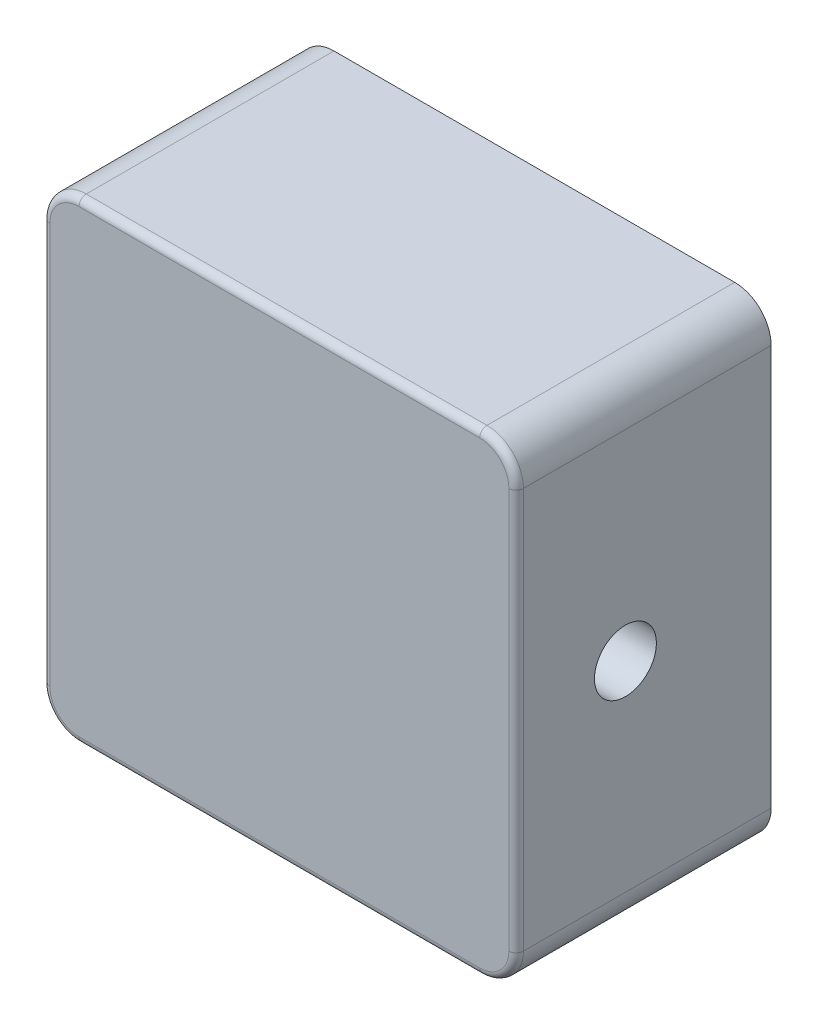
ISO-10303-21;
HEADER;
FILE_DESCRIPTION(('STEP AP214'),'2;1');
FILE_NAME('part.step','',(''),(''),'','','');
FILE_SCHEMA(('AUTOMOTIVE_DESIGN { 1 0 10303 214 1 1 1 1 }'));
ENDSEC;
DATA;
#1=APPLICATION_CONTEXT('core data for automotive mechanical design processes');
#2=APPLICATION_PROTOCOL_DEFINITION('international standard','automotive_design',2000,#1);
#3=PRODUCT_CONTEXT('',#1,'mechanical');
#4=PRODUCT('Part','Part','',(#3));
#5=PRODUCT_RELATED_PRODUCT_CATEGORY('part','',(#4));
#6=PRODUCT_DEFINITION_FORMATION('','',#4);
#7=PRODUCT_DEFINITION_CONTEXT('part definition',#1,'design');
#8=PRODUCT_DEFINITION('design','',#6,#7);
#9=PRODUCT_DEFINITION_SHAPE('','',#8);
#10=(LENGTH_UNIT() NAMED_UNIT(*) SI_UNIT(.MILLI.,.METRE.));
#11=(NAMED_UNIT(*) PLANE_ANGLE_UNIT() SI_UNIT($,.RADIAN.));
#12=(NAMED_UNIT(*) SI_UNIT($,.STERADIAN.) SOLID_ANGLE_UNIT());
#13=UNCERTAINTY_MEASURE_WITH_UNIT(LENGTH_MEASURE(1.E-05),#10,'distance_accuracy_value','');
#14=(GEOMETRIC_REPRESENTATION_CONTEXT(3) GLOBAL_UNCERTAINTY_ASSIGNED_CONTEXT((#13)) GLOBAL_UNIT_ASSIGNED_CONTEXT((#10,
#11,#12)) REPRESENTATION_CONTEXT('',''));
#15=CARTESIAN_POINT('',(0.,0.,0.));
#16=DIRECTION('',(0.,0.,1.));
#17=DIRECTION('',(1.,0.,0.));
#18=AXIS2_PLACEMENT_3D('',#15,#16,#17);
#19=CARTESIAN_POINT('',(0.,0.,177.8));
#20=DIRECTION('',(0.,0.,-1.));
#21=DIRECTION('',(-1.,0.,0.));
#22=AXIS2_PLACEMENT_3D('',#19,#20,#21);
#23=PLANE('',#22);
#24=CARTESIAN_POINT('',(139.7,139.7,177.8));
#25=DIRECTION('',(0.,0.,-1.));
#26=DIRECTION('',(-1.,0.,0.));
#27=AXIS2_PLACEMENT_3D('',#24,#25,#26);
#28=CIRCLE('',#27,20.32);
#29=CARTESIAN_POINT('',(139.7,160.02,177.8));
#30=VERTEX_POINT('',#29);
#31=CARTESIAN_POINT('',(160.02,139.7,177.8));
#32=VERTEX_POINT('',#31);
#33=EDGE_CURVE('E298',#30,#32,#28,.T.);
#34=ORIENTED_EDGE('',*,*,#33,.F.);
#35=DIRECTION('',(-1.,0.,0.));
#36=VECTOR('',#35,1.);
#37=CARTESIAN_POINT('',(0.,160.02,177.8));
#38=LINE('',#37,#36);
#39=CARTESIAN_POINT('',(-139.7,160.02,177.8));
#40=VERTEX_POINT('',#39);
#41=EDGE_CURVE('E312',#30,#40,#38,.T.);
#42=ORIENTED_EDGE('',*,*,#41,.T.);
#43=CARTESIAN_POINT('',(-139.7,139.7,177.8));
#44=DIRECTION('',(0.,0.,-1.));
#45=DIRECTION('',(-1.,0.,0.));
#46=AXIS2_PLACEMENT_3D('',#43,#44,#45);
#47=CIRCLE('',#46,20.32);
#48=CARTESIAN_POINT('',(-160.02,139.7,177.8));
#49=VERTEX_POINT('',#48);
#50=EDGE_CURVE('E339',#49,#40,#47,.T.);
#51=ORIENTED_EDGE('',*,*,#50,.F.);
#52=DIRECTION('',(0.,-1.,0.));
#53=VECTOR('',#52,1.);
#54=CARTESIAN_POINT('',(-160.02,0.,177.8));
#55=LINE('',#54,#53);
#56=CARTESIAN_POINT('',(-160.02,-139.7,177.8));
#57=VERTEX_POINT('',#56);
#58=EDGE_CURVE('E316',#49,#57,#55,.T.);
#59=ORIENTED_EDGE('',*,*,#58,.T.);
#60=CARTESIAN_POINT('',(-139.7,-139.7,177.8));
#61=DIRECTION('',(0.,0.,-1.));
#62=DIRECTION('',(-1.,0.,0.));
#63=AXIS2_PLACEMENT_3D('',#60,#61,#62);
#64=CIRCLE('',#63,20.32);
#65=CARTESIAN_POINT('',(-139.7,-160.02,177.8));
#66=VERTEX_POINT('',#65);
#67=EDGE_CURVE('E307',#66,#57,#64,.T.);
#68=ORIENTED_EDGE('',*,*,#67,.F.);
#69=DIRECTION('',(1.,0.,0.));
#70=VECTOR('',#69,1.);
#71=CARTESIAN_POINT('',(0.,-160.02,177.8));
#72=LINE('',#71,#70);
#73=CARTESIAN_POINT('',(139.7,-160.02,177.8));
#74=VERTEX_POINT('',#73);
#75=EDGE_CURVE('E305',#66,#74,#72,.T.);
#76=ORIENTED_EDGE('',*,*,#75,.T.);
#77=CARTESIAN_POINT('',(139.7,-139.7,177.8));
#78=DIRECTION('',(0.,0.,-1.));
#79=DIRECTION('',(-1.,0.,0.));
#80=AXIS2_PLACEMENT_3D('',#77,#78,#79);
#81=CIRCLE('',#80,20.32);
#82=CARTESIAN_POINT('',(160.02,-139.7,177.8));
#83=VERTEX_POINT('',#82);
#84=EDGE_CURVE('E291',#83,#74,#81,.T.);
#85=ORIENTED_EDGE('',*,*,#84,.F.);
#86=DIRECTION('',(0.,1.,0.));
#87=VECTOR('',#86,1.);
#88=CARTESIAN_POINT('',(160.02,0.,177.8));
#89=LINE('',#88,#87);
#90=EDGE_CURVE('E302',#83,#32,#89,.T.);
#91=ORIENTED_EDGE('',*,*,#90,.T.);
#92=EDGE_LOOP('',(#34,#42,#51,#59,#68,#76,#85,#91));
#93=FACE_BOUND('',#92,.T.);
#94=ADVANCED_FACE('F41',(#93),#23,.F.);
#95=CARTESIAN_POINT('',(165.1,-165.1,177.8));
#96=DIRECTION('',(-1.,0.,0.));
#97=DIRECTION('',(0.,0.,1.));
#98=AXIS2_PLACEMENT_3D('',#95,#96,#97);
#99=PLANE('',#98);
#100=CARTESIAN_POINT('',(165.1,0.,101.6));
#101=DIRECTION('',(-1.,0.,0.));
#102=DIRECTION('',(0.,0.,1.));
#103=AXIS2_PLACEMENT_3D('',#100,#101,#102);
#104=CIRCLE('',#103,21.59);
#105=CARTESIAN_POINT('',(165.1,0.,123.19));
#106=VERTEX_POINT('',#105);
#107=EDGE_CURVE('E171',#106,#106,#104,.T.);
#108=ORIENTED_EDGE('',*,*,#107,.T.);
#109=EDGE_LOOP('',(#108));
#110=FACE_BOUND('',#109,.T.);
#111=DIRECTION('',(0.,1.,0.));
#112=VECTOR('',#111,1.);
#113=CARTESIAN_POINT('',(165.1,-165.1,172.72));
#114=LINE('',#113,#112);
#115=CARTESIAN_POINT('',(165.1,139.7,172.72));
#116=VERTEX_POINT('',#115);
#117=CARTESIAN_POINT('',(165.1,-139.7,172.72));
#118=VERTEX_POINT('',#117);
#119=EDGE_CURVE('E308',#116,#118,#114,.F.);
#120=ORIENTED_EDGE('',*,*,#119,.T.);
#121=DIRECTION('',(0.,0.,-1.));
#122=VECTOR('',#121,1.);
#123=CARTESIAN_POINT('',(165.1,-139.7,177.8));
#124=LINE('',#123,#122);
#125=CARTESIAN_POINT('',(165.1,-139.7,0.));
#126=VERTEX_POINT('',#125);
#127=EDGE_CURVE('E369',#118,#126,#124,.T.);
#128=ORIENTED_EDGE('',*,*,#127,.T.);
#129=DIRECTION('',(0.,1.,0.));
#130=VECTOR('',#129,1.);
#131=CARTESIAN_POINT('',(165.1,-165.1,0.));
#132=LINE('',#131,#130);
#133=CARTESIAN_POINT('',(165.1,139.7,0.));
#134=VERTEX_POINT('',#133);
#135=EDGE_CURVE('E175',#126,#134,#132,.T.);
#136=ORIENTED_EDGE('',*,*,#135,.T.);
#137=DIRECTION('',(0.,0.,-1.));
#138=VECTOR('',#137,1.);
#139=CARTESIAN_POINT('',(165.1,139.7,177.8));
#140=LINE('',#139,#138);
#141=EDGE_CURVE('E366',#134,#116,#140,.F.);
#142=ORIENTED_EDGE('',*,*,#141,.T.);
#143=EDGE_LOOP('',(#120,#128,#136,#142));
#144=FACE_BOUND('',#143,.T.);
#145=ADVANCED_FACE('F221',(#110,#144),#99,.F.);
#146=CARTESIAN_POINT('',(-165.1,165.1,177.8));
#147=DIRECTION('',(0.,-1.,0.));
#148=DIRECTION('',(0.,0.,-1.));
#149=AXIS2_PLACEMENT_3D('',#146,#147,#148);
#150=PLANE('',#149);
#151=DIRECTION('',(-1.,0.,0.));
#152=VECTOR('',#151,1.);
#153=CARTESIAN_POINT('',(-165.1,165.1,0.));
#154=LINE('',#153,#152);
#155=CARTESIAN_POINT('',(139.7,165.1,0.));
#156=VERTEX_POINT('',#155);
#157=CARTESIAN_POINT('',(-139.7,165.1,0.));
#158=VERTEX_POINT('',#157);
#159=EDGE_CURVE('E179',#156,#158,#154,.T.);
#160=ORIENTED_EDGE('',*,*,#159,.T.);
#161=DIRECTION('',(0.,0.,-1.));
#162=VECTOR('',#161,1.);
#163=CARTESIAN_POINT('',(-139.7,165.1,177.8));
#164=LINE('',#163,#162);
#165=CARTESIAN_POINT('',(-139.7,165.1,172.72));
#166=VERTEX_POINT('',#165);
#167=EDGE_CURVE('E11',#158,#166,#164,.F.);
#168=ORIENTED_EDGE('',*,*,#167,.T.);
#169=DIRECTION('',(-1.,0.,0.));
#170=VECTOR('',#169,1.);
#171=CARTESIAN_POINT('',(-165.1,165.1,172.72));
#172=LINE('',#171,#170);
#173=CARTESIAN_POINT('',(139.7,165.1,172.72));
#174=VERTEX_POINT('',#173);
#175=EDGE_CURVE('E332',#166,#174,#172,.F.);
#176=ORIENTED_EDGE('',*,*,#175,.T.);
#177=DIRECTION('',(0.,0.,-1.));
#178=VECTOR('',#177,1.);
#179=CARTESIAN_POINT('',(139.7,165.1,177.8));
#180=LINE('',#179,#178);
#181=EDGE_CURVE('E51',#174,#156,#180,.T.);
#182=ORIENTED_EDGE('',*,*,#181,.T.);
#183=EDGE_LOOP('',(#160,#168,#176,#182));
#184=FACE_BOUND('',#183,.T.);
#185=ADVANCED_FACE('F226',(#184),#150,.F.);
#186=CARTESIAN_POINT('',(-165.1,-165.1,177.8));
#187=DIRECTION('',(1.,0.,0.));
#188=DIRECTION('',(0.,0.,-1.));
#189=AXIS2_PLACEMENT_3D('',#186,#187,#188);
#190=PLANE('',#189);
#191=CARTESIAN_POINT('',(-165.1,0.,101.6));
#192=DIRECTION('',(1.,0.,0.));
#193=DIRECTION('',(0.,0.,-1.));
#194=AXIS2_PLACEMENT_3D('',#191,#192,#193);
#195=CIRCLE('',#194,21.59);
#196=CARTESIAN_POINT('',(-165.1,0.,80.01));
#197=VERTEX_POINT('',#196);
#198=EDGE_CURVE('E167',#197,#197,#195,.T.);
#199=ORIENTED_EDGE('',*,*,#198,.T.);
#200=EDGE_LOOP('',(#199));
#201=FACE_BOUND('',#200,.T.);
#202=DIRECTION('',(0.,-1.,0.));
#203=VECTOR('',#202,1.);
#204=CARTESIAN_POINT('',(-165.1,-165.1,0.));
#205=LINE('',#204,#203);
#206=CARTESIAN_POINT('',(-165.1,139.7,0.));
#207=VERTEX_POINT('',#206);
#208=CARTESIAN_POINT('',(-165.1,-139.7,0.));
#209=VERTEX_POINT('',#208);
#210=EDGE_CURVE('E182',#207,#209,#205,.T.);
#211=ORIENTED_EDGE('',*,*,#210,.T.);
#212=DIRECTION('',(0.,0.,-1.));
#213=VECTOR('',#212,1.);
#214=CARTESIAN_POINT('',(-165.1,-139.7,177.8));
#215=LINE('',#214,#213);
#216=CARTESIAN_POINT('',(-165.1,-139.7,172.72));
#217=VERTEX_POINT('',#216);
#218=EDGE_CURVE('E392',#209,#217,#215,.F.);
#219=ORIENTED_EDGE('',*,*,#218,.T.);
#220=DIRECTION('',(0.,-1.,0.));
#221=VECTOR('',#220,1.);
#222=CARTESIAN_POINT('',(-165.1,-165.1,172.72));
#223=LINE('',#222,#221);
#224=CARTESIAN_POINT('',(-165.1,139.7,172.72));
#225=VERTEX_POINT('',#224);
#226=EDGE_CURVE('E328',#217,#225,#223,.F.);
#227=ORIENTED_EDGE('',*,*,#226,.T.);
#228=DIRECTION('',(0.,0.,-1.));
#229=VECTOR('',#228,1.);
#230=CARTESIAN_POINT('',(-165.1,139.7,177.8));
#231=LINE('',#230,#229);
#232=EDGE_CURVE('E389',#225,#207,#231,.T.);
#233=ORIENTED_EDGE('',*,*,#232,.T.);
#234=EDGE_LOOP('',(#211,#219,#227,#233));
#235=FACE_BOUND('',#234,.T.);
#236=ADVANCED_FACE('F238',(#201,#235),#190,.F.);
#237=CARTESIAN_POINT('',(-165.1,-165.1,177.8));
#238=DIRECTION('',(0.,1.,0.));
#239=DIRECTION('',(0.,0.,1.));
#240=AXIS2_PLACEMENT_3D('',#237,#238,#239);
#241=PLANE('',#240);
#242=CARTESIAN_POINT('',(0.,-165.1,101.6));
#243=DIRECTION('',(0.,-1.,0.));
#244=DIRECTION('',(0.,0.,-1.));
#245=AXIS2_PLACEMENT_3D('',#242,#243,#244);
#246=CIRCLE('',#245,21.59);
#247=CARTESIAN_POINT('',(0.,-165.1,80.01));
#248=VERTEX_POINT('',#247);
#249=EDGE_CURVE('E157',#248,#248,#246,.T.);
#250=ORIENTED_EDGE('',*,*,#249,.F.);
#251=EDGE_LOOP('',(#250));
#252=FACE_BOUND('',#251,.T.);
#253=DIRECTION('',(1.,0.,0.));
#254=VECTOR('',#253,1.);
#255=CARTESIAN_POINT('',(-165.1,-165.1,0.));
#256=LINE('',#255,#254);
#257=CARTESIAN_POINT('',(-139.7,-165.1,0.));
#258=VERTEX_POINT('',#257);
#259=CARTESIAN_POINT('',(139.7,-165.1,0.));
#260=VERTEX_POINT('',#259);
#261=EDGE_CURVE('E186',#258,#260,#256,.T.);
#262=ORIENTED_EDGE('',*,*,#261,.T.);
#263=DIRECTION('',(0.,0.,-1.));
#264=VECTOR('',#263,1.);
#265=CARTESIAN_POINT('',(139.7,-165.1,177.8));
#266=LINE('',#265,#264);
#267=CARTESIAN_POINT('',(139.7,-165.1,172.72));
#268=VERTEX_POINT('',#267);
#269=EDGE_CURVE('E386',#260,#268,#266,.F.);
#270=ORIENTED_EDGE('',*,*,#269,.T.);
#271=DIRECTION('',(1.,0.,0.));
#272=VECTOR('',#271,1.);
#273=CARTESIAN_POINT('',(-165.1,-165.1,172.72));
#274=LINE('',#273,#272);
#275=CARTESIAN_POINT('',(-139.7,-165.1,172.72));
#276=VERTEX_POINT('',#275);
#277=EDGE_CURVE('E324',#268,#276,#274,.F.);
#278=ORIENTED_EDGE('',*,*,#277,.T.);
#279=DIRECTION('',(0.,0.,-1.));
#280=VECTOR('',#279,1.);
#281=CARTESIAN_POINT('',(-139.7,-165.1,177.8));
#282=LINE('',#281,#280);
#283=EDGE_CURVE('E383',#276,#258,#282,.T.);
#284=ORIENTED_EDGE('',*,*,#283,.T.);
#285=EDGE_LOOP('',(#262,#270,#278,#284));
#286=FACE_BOUND('',#285,.T.);
#287=ADVANCED_FACE('F234',(#252,#286),#241,.F.);
#288=CARTESIAN_POINT('',(0.,0.,0.));
#289=DIRECTION('',(0.,0.,-1.));
#290=DIRECTION('',(-1.,0.,0.));
#291=AXIS2_PLACEMENT_3D('',#288,#289,#290);
#292=PLANE('',#291);
#293=CARTESIAN_POINT('',(0.,0.,0.));
#294=DIRECTION('',(0.,0.,-1.));
#295=DIRECTION('',(-1.,0.,0.));
#296=AXIS2_PLACEMENT_3D('',#293,#294,#295);
#297=CIRCLE('',#296,8.382);
#298=CARTESIAN_POINT('',(-8.382,0.,0.));
#299=VERTEX_POINT('',#298);
#300=EDGE_CURVE('E151',#299,#299,#297,.T.);
#301=ORIENTED_EDGE('',*,*,#300,.F.);
#302=EDGE_LOOP('',(#301));
#303=FACE_BOUND('',#302,.T.);
#304=ORIENTED_EDGE('',*,*,#135,.F.);
#305=CARTESIAN_POINT('',(139.7,-139.7,0.));
#306=DIRECTION('',(0.,0.,-1.));
#307=DIRECTION('',(-1.,0.,0.));
#308=AXIS2_PLACEMENT_3D('',#305,#306,#307);
#309=CIRCLE('',#308,25.4);
#310=EDGE_CURVE('E380',#126,#260,#309,.T.);
#311=ORIENTED_EDGE('',*,*,#310,.T.);
#312=ORIENTED_EDGE('',*,*,#261,.F.);
#313=CARTESIAN_POINT('',(-139.7,-139.7,0.));
#314=DIRECTION('',(0.,0.,-1.));
#315=DIRECTION('',(-1.,0.,0.));
#316=AXIS2_PLACEMENT_3D('',#313,#314,#315);
#317=CIRCLE('',#316,25.4);
#318=EDGE_CURVE('E377',#258,#209,#317,.T.);
#319=ORIENTED_EDGE('',*,*,#318,.T.);
#320=ORIENTED_EDGE('',*,*,#210,.F.);
#321=CARTESIAN_POINT('',(-139.7,139.7,0.));
#322=DIRECTION('',(0.,0.,-1.));
#323=DIRECTION('',(-1.,0.,0.));
#324=AXIS2_PLACEMENT_3D('',#321,#322,#323);
#325=CIRCLE('',#324,25.4);
#326=EDGE_CURVE('E59',#207,#158,#325,.T.);
#327=ORIENTED_EDGE('',*,*,#326,.T.);
#328=ORIENTED_EDGE('',*,*,#159,.F.);
#329=CARTESIAN_POINT('',(139.7,139.7,0.));
#330=DIRECTION('',(0.,0.,-1.));
#331=DIRECTION('',(-1.,0.,0.));
#332=AXIS2_PLACEMENT_3D('',#329,#330,#331);
#333=CIRCLE('',#332,25.4);
#334=EDGE_CURVE('E372',#156,#134,#333,.T.);
#335=ORIENTED_EDGE('',*,*,#334,.T.);
#336=EDGE_LOOP('',(#304,#311,#312,#319,#320,#327,#328,#335));
#337=FACE_BOUND('',#336,.T.);
#338=ADVANCED_FACE('F231',(#303,#337),#292,.T.);
#339=CARTESIAN_POINT('',(-165.1,0.,101.6));
#340=DIRECTION('',(1.,0.,0.));
#341=DIRECTION('',(0.,0.,-1.));
#342=AXIS2_PLACEMENT_3D('',#339,#340,#341);
#343=CYLINDRICAL_SURFACE('',#342,21.59);
#344=CARTESIAN_POINT('',(0.,0.,101.6));
#345=DIRECTION('',(0.707106781186547,0.707106781186547,0.));
#346=DIRECTION('',(0.707106781186547,-0.707106781186547,0.));
#347=AXIS2_PLACEMENT_3D('',#344,#345,#346);
#348=ELLIPSE('',#347,30.5328708116351,21.59);
#349=CARTESIAN_POINT('',(5.92696903990567,-5.92696903990561,80.8394812685232));
#350=VERTEX_POINT('',#349);
#351=CARTESIAN_POINT('',(0.,0.,123.19));
#352=VERTEX_POINT('',#351);
#353=EDGE_CURVE('E144',#350,#352,#348,.F.);
#354=ORIENTED_EDGE('',*,*,#353,.T.);
#355=CARTESIAN_POINT('',(0.,0.,101.6));
#356=DIRECTION('',(0.707106781186547,-0.707106781186547,0.));
#357=DIRECTION('',(0.707106781186547,0.707106781186547,0.));
#358=AXIS2_PLACEMENT_3D('',#355,#356,#357);
#359=ELLIPSE('',#358,30.5328708116351,21.59);
#360=CARTESIAN_POINT('',(-5.92696903990567,-5.92696903990562,80.8394812685232));
#361=VERTEX_POINT('',#360);
#362=EDGE_CURVE('E141',#352,#361,#359,.T.);
#363=ORIENTED_EDGE('',*,*,#362,.T.);
#364=CARTESIAN_POINT('',(-8.382,0.,80.01));
#365=CARTESIAN_POINT('',(-8.38200145033635,0.226370568657788,80.0099989138097));
#366=CARTESIAN_POINT('',(-8.37282289777785,0.452721919749313,80.0135677018226));
#367=CARTESIAN_POINT('',(-8.33620935186898,0.903720958138195,80.0277429909222));
#368=CARTESIAN_POINT('',(-8.30877497383841,1.12836870259818,80.0383492548081));
#369=CARTESIAN_POINT('',(-8.23594044078842,1.57423889942899,80.0663109489509));
#370=CARTESIAN_POINT('',(-8.19054489182278,1.79546221487572,80.0836646488415));
#371=CARTESIAN_POINT('',(-8.08223369184876,2.23298328766616,80.1246614266243));
#372=CARTESIAN_POINT('',(-8.01931745798016,2.44928088088697,80.1483047137509));
#373=CARTESIAN_POINT('',(-7.87670897876559,2.87500684270109,80.2012068358184));
#374=CARTESIAN_POINT('',(-7.79705489401773,3.08444960523504,80.2304528838626));
#375=CARTESIAN_POINT('',(-7.62153385444664,3.49573405586599,80.2938680589026));
#376=CARTESIAN_POINT('',(-7.52566125098669,3.69757306565513,80.3280389005049));
#377=CARTESIAN_POINT('',(-7.31848123842625,4.09236465925206,80.4004498210225));
#378=CARTESIAN_POINT('',(-7.207175697474,4.28531831486664,80.4386894072885));
#379=CARTESIAN_POINT('',(-6.96986595234745,4.66136744403012,80.5183323129778));
#380=CARTESIAN_POINT('',(-6.84385643228888,4.84445931709716,80.5597367747112));
#381=CARTESIAN_POINT('',(-6.57259960517665,5.2069328120414,80.6464306918641));
#382=CARTESIAN_POINT('',(-6.42678059920686,5.38586537744169,80.6918095318447));
#383=CARTESIAN_POINT('',(-6.12105997324607,5.7309414018714,80.7837491053967));
#384=CARTESIAN_POINT('',(-5.96115790750256,5.89708445577914,80.8303098763449));
#385=CARTESIAN_POINT('',(-5.62813037716263,6.21572252971234,80.9234320661311));
#386=CARTESIAN_POINT('',(-5.4549984522609,6.36821080198187,80.969993474041));
#387=CARTESIAN_POINT('',(-5.09661473983286,6.65849849275185,81.061848382183));
#388=CARTESIAN_POINT('',(-4.91136704158587,6.79630282646349,81.1071423029188));
#389=CARTESIAN_POINT('',(-4.5217107629924,7.06186561226161,81.1970926206819));
#390=CARTESIAN_POINT('',(-4.31682442472723,7.18896038017676,81.2416426163655));
#391=CARTESIAN_POINT('',(-3.89629330397689,7.42529270322454,81.3266455464998));
#392=CARTESIAN_POINT('',(-3.68065290495948,7.5345374578035,81.3671001302359));
#393=CARTESIAN_POINT('',(-3.23996605565272,7.73427812179693,81.442608080843));
#394=CARTESIAN_POINT('',(-3.0149207240576,7.82477625349242,81.477662087788));
#395=CARTESIAN_POINT('',(-2.55699641432717,7.98615146768632,81.5411611673985));
#396=CARTESIAN_POINT('',(-2.32411793427076,8.05702979509524,81.5696066593672));
#397=CARTESIAN_POINT('',(-1.86253332187649,8.17576904998631,81.6177872083411));
#398=CARTESIAN_POINT('',(-1.63408319967396,8.22449379590704,81.6378461150302));
#399=CARTESIAN_POINT('',(-1.17337573712479,8.30275250584003,81.6702683731867));
#400=CARTESIAN_POINT('',(-0.941118500917671,8.33228699388605,81.6826319347927));
#401=CARTESIAN_POINT('',(-0.474746981557583,8.37181492579503,81.6992141771231));
#402=CARTESIAN_POINT('',(-0.240633455849082,8.38181596577191,81.7034360239672));
#403=CARTESIAN_POINT('',(0.227606450540261,8.3821789727159,81.703588795554));
#404=CARTESIAN_POINT('',(0.46173283024255,8.37254177991938,81.6995200750148));
#405=CARTESIAN_POINT('',(0.912860372796346,8.33501401190719,81.6837750983014));
#406=CARTESIAN_POINT('',(1.12998322606291,8.30835393281725,81.6726119025991));
#407=CARTESIAN_POINT('',(1.5611159485187,8.23823729429393,81.6435227032893));
#408=CARTESIAN_POINT('',(1.77512471005417,8.19477490298474,81.6255943516313));
#409=CARTESIAN_POINT('',(2.1984645277233,8.09148570436307,81.5835302461839));
#410=CARTESIAN_POINT('',(2.40779677973882,8.03166313372861,81.5593960995611));
#411=CARTESIAN_POINT('',(2.82061546219126,7.89615534332456,81.505619179306));
#412=CARTESIAN_POINT('',(3.02409961657062,7.82046404007936,81.4759742935587));
#413=CARTESIAN_POINT('',(3.4278301632969,7.65223177243254,81.4113963320718));
#414=CARTESIAN_POINT('',(3.62793791113702,7.55939335228058,81.3763721023516));
#415=CARTESIAN_POINT('',(4.01971908479984,7.35855015480923,81.3024314503409));
#416=CARTESIAN_POINT('',(4.21138962043266,7.25054023273912,81.2635137090299));
#417=CARTESIAN_POINT('',(4.58524536503745,7.02009076008704,81.1828178540164));
#418=CARTESIAN_POINT('',(4.76742938946858,6.89764941371342,81.1410393846074));
#419=CARTESIAN_POINT('',(5.12137364149001,6.63908839919386,81.0556786810507));
#420=CARTESIAN_POINT('',(5.29313336242037,6.50296806705091,81.012096359402));
#421=CARTESIAN_POINT('',(5.63744866169182,6.20743417818956,80.9209896378856));
#422=CARTESIAN_POINT('',(5.80915461552773,6.0470466853502,80.8734089627864));
#423=CARTESIAN_POINT('',(6.13851071157491,5.71241713044194,80.7786980608922));
#424=CARTESIAN_POINT('',(6.29616504123651,5.53817922534134,80.7315677036634));
#425=CARTESIAN_POINT('',(6.59657740056903,5.17671173739009,80.6389748331717));
#426=CARTESIAN_POINT('',(6.73932712093208,4.98947500351757,80.5935132593147));
#427=CARTESIAN_POINT('',(7.00880119947126,4.60326515222091,80.5055160117842));
#428=CARTESIAN_POINT('',(7.13553195325256,4.4042967655087,80.462979173517));
#429=CARTESIAN_POINT('',(7.37423107855262,3.99204118203067,80.3812192996153));
#430=CARTESIAN_POINT('',(7.48588971162069,3.77855962401164,80.3420704354502));
#431=CARTESIAN_POINT('',(7.69066334190654,3.34210982676781,80.2690992614042));
#432=CARTESIAN_POINT('',(7.78378622402351,3.1191456705321,80.2352746879167));
#433=CARTESIAN_POINT('',(7.95064225998697,2.66526927782709,80.1739208817295));
#434=CARTESIAN_POINT('',(8.02437857879124,2.43435834568016,80.1463906215461));
#435=CARTESIAN_POINT('',(8.15170432405794,1.96632772827397,80.0984424938882));
#436=CARTESIAN_POINT('',(8.20529505437069,1.72920844589058,80.0780241661258));
#437=CARTESIAN_POINT('',(8.28929449510487,1.26418406424981,80.0458550388869));
#438=CARTESIAN_POINT('',(8.32083970614812,1.03651304548717,80.0336805246555));
#439=CARTESIAN_POINT('',(8.36512899136158,0.57908115672036,80.0165540602865));
#440=CARTESIAN_POINT('',(8.3778737720339,0.349320365574332,80.0116018387422));
#441=CARTESIAN_POINT('',(8.38442448126611,-0.11046210452078,80.0090588109095));
#442=CARTESIAN_POINT('',(8.37823439726684,-0.34048371834621,80.0114664547272));
#443=CARTESIAN_POINT('',(8.34699112192023,-0.79904571629887,80.0235723768935));
#444=CARTESIAN_POINT('',(8.3219382554407,-1.02758612586805,80.0332705296799));
#445=CARTESIAN_POINT('',(8.25468485647107,-1.47188476695224,80.0591299612001));
#446=CARTESIAN_POINT('',(8.21324978067462,-1.68777635029091,80.0750022798421));
#447=CARTESIAN_POINT('',(8.11369008155528,-2.11521336057164,80.1127939953362));
#448=CARTESIAN_POINT('',(8.05555960011768,-2.32675723401408,80.134715514637));
#449=CARTESIAN_POINT('',(7.92315008642559,-2.74399544762673,80.1840547074943));
#450=CARTESIAN_POINT('',(7.84887567768209,-2.94969144355583,80.2114708072655));
#451=CARTESIAN_POINT('',(7.6847508701546,-3.35412821454461,80.2711526612862));
#452=CARTESIAN_POINT('',(7.59489455187045,-3.5528663117172,80.3034202579767));
#453=CARTESIAN_POINT('',(7.39741143324641,-3.94796691311622,80.3730575983945));
#454=CARTESIAN_POINT('',(7.28933597203511,-4.14408339886614,80.4105504485543));
#455=CARTESIAN_POINT('',(7.05816074807445,-4.52661633501834,80.4889605928592));
#456=CARTESIAN_POINT('',(6.93505583065644,-4.71302942599412,80.5298790603712));
#457=CARTESIAN_POINT('',(6.67464398537264,-5.07511477606928,80.6141506965643));
#458=CARTESIAN_POINT('',(6.5373347972498,-5.25078531866048,80.657504252226));
#459=CARTESIAN_POINT('',(6.24935720463141,-5.59044171749288,80.7456035624353));
#460=CARTESIAN_POINT('',(6.09868826325246,-5.75442710366903,80.7903493728859));
#461=CARTESIAN_POINT('',(5.77502191158471,-6.07971398936137,80.8829651150677));
#462=CARTESIAN_POINT('',(5.60121762802773,-6.24020787670238,80.9308555904454));
#463=CARTESIAN_POINT('',(5.24057469672656,-6.54600482257277,81.0256580776639));
#464=CARTESIAN_POINT('',(5.05374018422598,-6.69131266426323,81.072570393847));
#465=CARTESIAN_POINT('',(4.66796790761882,-6.96592306595939,81.1641251465461));
#466=CARTESIAN_POINT('',(4.46902371295206,-7.09521700960468,81.2087663535342));
#467=CARTESIAN_POINT('',(4.0603861122567,-7.33672201623662,81.2944090043023));
#468=CARTESIAN_POINT('',(3.85069727781438,-7.44894026515864,81.3354119761093));
#469=CARTESIAN_POINT('',(3.4201995839209,-7.65621639981817,81.4128063210861));
#470=CARTESIAN_POINT('',(3.19931973649926,-7.75114072537747,81.4491612043127));
#471=CARTESIAN_POINT('',(2.74949026947134,-7.92187288175816,81.5156670615244));
#472=CARTESIAN_POINT('',(2.52054432602657,-7.99768929586253,81.5458208199335));
#473=CARTESIAN_POINT('',(2.05625673222925,-8.1294489525053,81.5988697702932));
#474=CARTESIAN_POINT('',(1.82091727824699,-8.18539892913011,81.6217674215484));
#475=CARTESIAN_POINT('',(1.34565816937513,-8.27681525780177,81.6594662639424));
#476=CARTESIAN_POINT('',(1.10573886823107,-8.31228318531336,81.6742680778028));
#477=CARTESIAN_POINT('',(0.63986257991367,-8.3605943481756,81.6944934346546));
#478=CARTESIAN_POINT('',(0.414072684809401,-8.37481883191999,81.7004890588125));
#479=CARTESIAN_POINT('',(-0.0379859841309769,-8.38496203759582,81.7047607194616));
#480=CARTESIAN_POINT('',(-0.264254734660955,-8.38088163084628,81.7030371233903));
#481=CARTESIAN_POINT('',(-0.715506668702875,-8.35446310992102,81.6919300741066));
#482=CARTESIAN_POINT('',(-0.94048998276577,-8.33212688426212,81.6825474132045));
#483=CARTESIAN_POINT('',(-1.38749750172483,-8.26944443510608,81.6564411880055));
#484=CARTESIAN_POINT('',(-1.60952171425596,-8.22909825808684,81.6397176426529));
#485=CARTESIAN_POINT('',(-2.0412283016023,-8.13255762817336,81.6001945079381));
#486=CARTESIAN_POINT('',(-2.25106946761195,-8.07697408724542,81.5776307049591));
#487=CARTESIAN_POINT('',(-2.66525600625254,-7.94992329950459,81.5268463509436));
#488=CARTESIAN_POINT('',(-2.86959942499593,-7.87845048713459,81.4986238181565));
#489=CARTESIAN_POINT('',(-3.27149324569804,-7.72022499564789,81.4373261712307));
#490=CARTESIAN_POINT('',(-3.46904479090894,-7.63347490330218,81.4042518787571));
#491=CARTESIAN_POINT('',(-3.85634847692535,-7.4453284150777,81.3341355670596));
#492=CARTESIAN_POINT('',(-4.0460975502624,-7.34392632830307,81.2970920076074));
#493=CARTESIAN_POINT('',(-4.62237119320888,-7.00688465348687,81.177204380197));
#494=CARTESIAN_POINT('',(-4.99396542792093,-6.7470014386854,81.0890919306993));
#495=CARTESIAN_POINT('',(-5.68997276632889,-6.17140251582188,80.908635813292));
#496=CARTESIAN_POINT('',(-6.01437027849389,-5.8556684332958,80.8162907603221));
#497=CARTESIAN_POINT('',(-6.46894950417166,-5.33554261392224,80.6788388916966));
#498=CARTESIAN_POINT('',(-6.61879811198243,-5.14849042492137,80.6319130847385));
#499=CARTESIAN_POINT('',(-6.90218666705357,-4.76184088368385,80.5407418480139));
#500=CARTESIAN_POINT('',(-7.03573261820351,-4.56224819109087,80.4964954345326));
#501=CARTESIAN_POINT('',(-7.28560158398471,-4.15159612180658,80.4118822587298));
#502=CARTESIAN_POINT('',(-7.4019132546751,-3.940529316446,80.3715180578353));
#503=CARTESIAN_POINT('',(-7.61619117261011,-3.5085132680228,80.2958572337172));
#504=CARTESIAN_POINT('',(-7.71416502911981,-3.28756817131151,80.2605585100018));
#505=CARTESIAN_POINT('',(-7.89746587638564,-2.82054088400675,80.1936383716215));
#506=CARTESIAN_POINT('',(-7.98131639403413,-2.57380959048882,80.1624837181695));
#507=CARTESIAN_POINT('',(-8.12585874058074,-2.07275959363921,80.1082512657985));
#508=CARTESIAN_POINT('',(-8.18654869223499,-1.81844027707256,80.0851741216021));
#509=CARTESIAN_POINT('',(-8.28395416439022,-1.30473625787452,80.0479224797002));
#510=CARTESIAN_POINT('',(-8.32068178620789,-1.04535418028123,80.0337434884393));
#511=CARTESIAN_POINT('',(-8.36970196107865,-0.523972546332088,80.0147836092976));
#512=CARTESIAN_POINT('',(-8.38199832155941,-0.261973404223109,80.0100012570229));
#513=CARTESIAN_POINT('',(-8.382,0.,80.01));
#514=B_SPLINE_CURVE_WITH_KNOTS('',3,(#364,#365,#366,#367,#368,#369,#370,#371,#372,#373,#374,
#375,#376,#377,#378,#379,#380,#381,#382,#383,#384,#385,#386,#387,#388,#389,#390,#391,#392,#393,
#394,#395,#396,#397,#398,#399,#400,#401,#402,#403,#404,#405,#406,#407,#408,#409,#410,#411,#412,
#413,#414,#415,#416,#417,#418,#419,#420,#421,#422,#423,#424,#425,#426,#427,#428,#429,#430,#431,
#432,#433,#434,#435,#436,#437,#438,#439,#440,#441,#442,#443,#444,#445,#446,#447,#448,#449,#450,
#451,#452,#453,#454,#455,#456,#457,#458,#459,#460,#461,#462,#463,#464,#465,#466,#467,#468,#469,
#470,#471,#472,#473,#474,#475,#476,#477,#478,#479,#480,#481,#482,#483,#484,#485,#486,#487,#488,
#489,#490,#491,#492,#493,#494,#495,#496,#497,#498,#499,#500,#501,#502,#503,#504,#505,#506,#507,
#508,#509,#510,#511,#512,#513),.UNSPECIFIED.,.T.,.F.,(4,2,2,2,2,2,2,2,2,2,2,2,2,2,2,2,2,2,2,2,2,
2,2,2,2,2,2,2,2,2,2,2,2,2,2,2,2,2,2,2,2,2,2,2,2,2,2,2,2,2,2,2,2,2,2,2,2,2,2,2,2,2,2,2,2,2,2,2,2,
2,2,2,2,2,4),(0.,0.678865519999188,1.35770815972735,2.03637682632174,2.71506807286884,
3.39222844252547,4.06962514312164,4.7469399167067,5.42450032092263,6.12944614063811,
6.83441428109777,7.53972889357939,8.24480666678503,8.97945432773768,9.71380494788652,
10.4480684660264,11.1822853831909,11.8847083550473,12.5871121448362,13.2892427313306,
13.9913432772771,14.6476881899916,15.3042611167744,15.9606641763273,16.6173193377958,
17.2866692363238,17.9562466660156,18.625907503522,19.2956008630142,20.0139721596923,
20.7321286575177,21.4506834129341,22.168950371604,22.9002558508997,23.6312495731176,
24.3621238825834,25.0929508807063,25.7825803581825,26.4721839193849,27.1616422688761,
27.8510887443136,28.5115404578844,29.1722241956836,29.8327189668854,30.4934652091097,
31.173842997844,31.8544547954932,32.5351750626943,33.2159226981538,33.9391965402316,
34.6622418811986,35.3856745858023,36.1088020024479,36.8372970200052,37.5654642116454,
38.2933843417545,39.0212484733008,39.6993406926764,40.3774006349738,41.0553904426168,
41.7333785005961,42.3873903300919,43.0416316031691,43.6957622054966,44.3501475612504,
45.729619616113,47.1095463525724,47.8414675406379,48.5731183607149,49.3052486485442,
50.0370744625553,50.823165859467,51.6093209582763,52.3950787296579,53.1807140370142),.UNSPECIFIED.);
#515=EDGE_CURVE('E155',#361,#350,#514,.T.);
#516=ORIENTED_EDGE('',*,*,#515,.T.);
#517=EDGE_LOOP('',(#354,#363,#516));
#518=FACE_BOUND('',#517,.T.);
#519=ORIENTED_EDGE('',*,*,#198,.F.);
#520=EDGE_LOOP('',(#519));
#521=FACE_BOUND('',#520,.T.);
#522=ORIENTED_EDGE('',*,*,#107,.F.);
#523=EDGE_LOOP('',(#522));
#524=FACE_BOUND('',#523,.T.);
#525=ADVANCED_FACE('F153',(#518,#521,#524),#343,.F.);
#526=CARTESIAN_POINT('',(0.,0.,101.6));
#527=DIRECTION('',(0.,0.,-1.));
#528=DIRECTION('',(-1.,0.,0.));
#529=AXIS2_PLACEMENT_3D('',#526,#527,#528);
#530=CYLINDRICAL_SURFACE('',#529,8.382);
#531=ORIENTED_EDGE('',*,*,#300,.T.);
#532=EDGE_LOOP('',(#531));
#533=FACE_BOUND('',#532,.T.);
#534=ORIENTED_EDGE('',*,*,#515,.F.);
#535=CARTESIAN_POINT('',(-8.382,0.,81.7035134759928));
#536=CARTESIAN_POINT('',(-8.38203505372542,-0.22610395172242,81.7035590988825));
#537=CARTESIAN_POINT('',(-8.37285294267391,-0.452189514782555,81.6996608206185));
#538=CARTESIAN_POINT('',(-8.33631744446659,-0.902550716608962,81.6843119448765));
#539=CARTESIAN_POINT('',(-8.30897058217425,-1.12682697601732,81.6728640592635));
#540=CARTESIAN_POINT('',(-8.23650420907551,-1.57112785962483,81.6428073809982));
#541=CARTESIAN_POINT('',(-8.19145162639205,-1.79116525871673,81.6242255608619));
#542=CARTESIAN_POINT('',(-8.08403796630851,-2.22631336817299,81.5805142377746));
#543=CARTESIAN_POINT('',(-8.02167591766231,-2.44142380134848,81.5553843674128));
#544=CARTESIAN_POINT('',(-7.88031299059003,-2.86502932859441,81.4993899039426));
#545=CARTESIAN_POINT('',(-7.80133261426292,-3.07353221306374,81.468532382538));
#546=CARTESIAN_POINT('',(-7.62732389707238,-3.48301064610695,81.4019628069732));
#547=CARTESIAN_POINT('',(-7.53228955322513,-3.68398334448157,81.3662489378799));
#548=CARTESIAN_POINT('',(-7.32686555417233,-4.07727979414418,81.2909599705992));
#549=CARTESIAN_POINT('',(-7.21646878019439,-4.2695994807365,81.2513830848879));
#550=CARTESIAN_POINT('',(-6.98106120463028,-4.64453751277725,81.1694243981995));
#551=CARTESIAN_POINT('',(-6.85604510116729,-4.82715230348875,81.1270415820505));
#552=CARTESIAN_POINT('',(-6.58584124871676,-5.19020763560128,81.0384834562529));
#553=CARTESIAN_POINT('',(-6.4399724687001,-5.37012106375745,80.9922237854423));
#554=CARTESIAN_POINT('',(-6.13394606922111,-5.71718106985022,80.8990728627862));
#555=CARTESIAN_POINT('',(-5.97378806733314,-5.88432730587326,80.8521815940656));
#556=CARTESIAN_POINT('',(-5.64004611314342,-6.20494693346702,80.7589826969612));
#557=CARTESIAN_POINT('',(-5.4664572236086,-6.35841525195613,80.7126752905515));
#558=CARTESIAN_POINT('',(-5.10694619972598,-6.65061376844015,80.6218790525001));
#559=CARTESIAN_POINT('',(-4.92102835787156,-6.78934905263278,80.5773895965428));
#560=CARTESIAN_POINT('',(-4.53068680845176,-7.05611414724688,80.4897546559911));
#561=CARTESIAN_POINT('',(-4.32583112541129,-7.18354992530452,80.4467215752116));
#562=CARTESIAN_POINT('',(-3.90530409132138,-7.42056281924112,80.3650629273346));
#563=CARTESIAN_POINT('',(-3.68963715287232,-7.53014714479833,80.3264355827887));
#564=CARTESIAN_POINT('',(-3.24888452108753,-7.73054133858532,80.2546799047645));
#565=CARTESIAN_POINT('',(-3.02379971361361,-7.82135296785672,80.2215510555371));
#566=CARTESIAN_POINT('',(-2.56583280330658,-7.98332052851624,80.1617651830139));
#567=CARTESIAN_POINT('',(-2.33295116816246,-8.05447763651139,80.1351077723206));
#568=CARTESIAN_POINT('',(-1.87203297414337,-8.17358229273479,80.0901249086375));
#569=CARTESIAN_POINT('',(-1.644264619888,-8.22244520112949,80.071473196457));
#570=CARTESIAN_POINT('',(-1.18498717867612,-8.30108439338189,80.0413160065913));
#571=CARTESIAN_POINT('',(-0.953478196349615,-8.33086121015697,80.0298103293765));
#572=CARTESIAN_POINT('',(-0.488598147752807,-8.37099832172762,80.0142767984288));
#573=CARTESIAN_POINT('',(-0.255227622319735,-8.38136406350948,80.0102468469183));
#574=CARTESIAN_POINT('',(0.21156831581182,-8.3825790843681,80.0097752250489));
#575=CARTESIAN_POINT('',(0.444993726461215,-8.37342900293854,80.0133333060457));
#576=CARTESIAN_POINT('',(0.897640561414095,-8.33672307445639,80.0275438491627));
#577=CARTESIAN_POINT('',(1.11695662546656,-8.31017297109103,80.0378085654666));
#578=CARTESIAN_POINT('',(1.55250046652819,-8.23992354943919,80.0647854935853));
#579=CARTESIAN_POINT('',(1.76872713497256,-8.19621822796254,80.0814999623515));
#580=CARTESIAN_POINT('',(2.19646722876985,-8.09208830354614,80.1209462272703));
#581=CARTESIAN_POINT('',(2.40798228645596,-8.03166959144002,80.1436759031694));
#582=CARTESIAN_POINT('',(2.82509716671805,-7.89461608494466,80.1946013194183));
#583=CARTESIAN_POINT('',(3.0306947112421,-7.81797513791429,80.2227991333392));
#584=CARTESIAN_POINT('',(3.43757310030588,-7.64789753692869,80.2844155235711));
#585=CARTESIAN_POINT('',(3.63874843340651,-7.55423389540496,80.317903740484));
#586=CARTESIAN_POINT('',(4.0325408136063,-7.35157092341785,80.3889942157862));
#587=CARTESIAN_POINT('',(4.22515491724197,-7.24256637139879,80.4265978739673));
#588=CARTESIAN_POINT('',(4.60071803538817,-7.01000050707192,80.5050171715028));
#589=CARTESIAN_POINT('',(4.78366608179098,-6.88643774066843,80.5458331315712));
#590=CARTESIAN_POINT('',(5.13892815188453,-6.6255502579341,80.6297153708058));
#591=CARTESIAN_POINT('',(5.31124164698043,-6.48822485841455,80.6727817616344));
#592=CARTESIAN_POINT('',(5.65475489553289,-6.19163334566506,80.7628861441723));
#593=CARTESIAN_POINT('',(5.82521395826981,-6.03153279186796,80.8100042583322));
#594=CARTESIAN_POINT('',(6.15209765785167,-5.69773412696171,80.9043788793153));
#595=CARTESIAN_POINT('',(6.30852643275692,-5.52404005358276,80.9516353410602));
#596=CARTESIAN_POINT('',(6.60658965161404,-5.16387239726059,81.0450616778751));
#597=CARTESIAN_POINT('',(6.74821236952864,-4.9773888760555,81.0912306696119));
#598=CARTESIAN_POINT('',(7.01555203566506,-4.59290293801951,81.1811357633398));
#599=CARTESIAN_POINT('',(7.14127514859455,-4.39490502936714,81.2248728045557));
#600=CARTESIAN_POINT('',(7.37907209097841,-3.98311680386497,81.3097619908608));
#601=CARTESIAN_POINT('',(7.49069972243654,-3.76904803077426,81.3508158379154));
#602=CARTESIAN_POINT('',(7.69532977331611,-3.3313888689064,81.4276934899417));
#603=CARTESIAN_POINT('',(7.78834017370577,-3.10780261021665,81.4635195342128));
#604=CARTESIAN_POINT('',(7.95480494026736,-2.652846487974,81.5286978621036));
#605=CARTESIAN_POINT('',(8.02828286422321,-2.42148638335463,81.5580579368157));
#606=CARTESIAN_POINT('',(8.15501440579987,-1.95259471722114,81.6092892721716));
#607=CARTESIAN_POINT('',(8.20827711880861,-1.71506598266566,81.6311639002899));
#608=CARTESIAN_POINT('',(8.29458564822831,-1.2323441640418,81.6668571823866));
#609=CARTESIAN_POINT('',(8.32734538381729,-0.987090707891522,81.6805617182637));
#610=CARTESIAN_POINT('',(8.36012465126767,-0.617683287977781,81.6943089624908));
#611=CARTESIAN_POINT('',(8.36832434397913,-0.494324636679047,81.6977564388455));
#612=CARTESIAN_POINT('',(8.37926244728501,-0.247317237039491,81.7023599348043));
#613=CARTESIAN_POINT('',(8.38200060866845,-0.123668475718609,81.7035158498438));
#614=CARTESIAN_POINT('',(8.382,0.,81.7035134759928));
#615=B_SPLINE_CURVE_WITH_KNOTS('',3,(#535,#536,#537,#538,#539,#540,#541,#542,#543,#544,#545,
#546,#547,#548,#549,#550,#551,#552,#553,#554,#555,#556,#557,#558,#559,#560,#561,#562,#563,#564,
#565,#566,#567,#568,#569,#570,#571,#572,#573,#574,#575,#576,#577,#578,#579,#580,#581,#582,#583,
#584,#585,#586,#587,#588,#589,#590,#591,#592,#593,#594,#595,#596,#597,#598,#599,#600,#601,#602,
#603,#604,#605,#606,#607,#608,#609,#610,#611,#612,#613,#614),.UNSPECIFIED.,.F.,.F.,(4,2,2,2,2,2,
2,2,2,2,2,2,2,2,2,2,2,2,2,2,2,2,2,2,2,2,2,2,2,2,2,2,2,2,2,2,2,2,2,4),(0.,0.678063199339373,
1.35588296683063,2.03116482662583,2.70648458461635,3.38097603224231,4.05572024979525,
4.73077818369531,5.40608169924275,6.11386842378207,6.82167409666138,7.52974120857266,
8.23756307856162,8.97184372902657,9.70582708587012,10.4397415574361,11.1736120840919,
11.873799895018,12.5739681546119,13.2739399089244,13.9738887269438,14.6365764290724,
15.2994962350418,15.9621826840857,16.6251209234207,17.2976519172681,17.9704123752861,
18.6432400866556,19.3161012143199,20.0309561892677,20.7455996284425,21.4608048273508,
22.1757318660548,22.9094706737235,23.6428942601244,24.3754292217905,25.1076342037005,
25.8498404105738,26.2207541354963,26.5916847849143),.UNSPECIFIED.);
#616=EDGE_CURVE('E146',#361,#350,#615,.T.);
#617=ORIENTED_EDGE('',*,*,#616,.T.);
#618=EDGE_LOOP('',(#534,#617));
#619=FACE_BOUND('',#618,.T.);
#620=ADVANCED_FACE('F205',(#533,#619),#530,.F.);
#621=CARTESIAN_POINT('',(0.,0.,101.6));
#622=DIRECTION('',(0.,-1.,0.));
#623=DIRECTION('',(0.,0.,-1.));
#624=AXIS2_PLACEMENT_3D('',#621,#622,#623);
#625=CYLINDRICAL_SURFACE('',#624,21.59);
#626=ORIENTED_EDGE('',*,*,#249,.T.);
#627=EDGE_LOOP('',(#626));
#628=FACE_BOUND('',#627,.T.);
#629=ORIENTED_EDGE('',*,*,#353,.F.);
#630=ORIENTED_EDGE('',*,*,#616,.F.);
#631=ORIENTED_EDGE('',*,*,#362,.F.);
#632=EDGE_LOOP('',(#629,#630,#631));
#633=FACE_BOUND('',#632,.T.);
#634=ADVANCED_FACE('F143',(#628,#633),#625,.F.);
#635=CARTESIAN_POINT('',(0.,160.02,172.72));
#636=DIRECTION('',(-1.,0.,0.));
#637=DIRECTION('',(0.,0.,1.));
#638=AXIS2_PLACEMENT_3D('',#635,#636,#637);
#639=CYLINDRICAL_SURFACE('',#638,5.08);
#640=ORIENTED_EDGE('',*,*,#175,.F.);
#641=CARTESIAN_POINT('',(-139.7,160.02,172.72));
#642=DIRECTION('',(1.,0.,0.));
#643=DIRECTION('',(0.,0.,-1.));
#644=AXIS2_PLACEMENT_3D('',#641,#642,#643);
#645=CIRCLE('',#644,5.08);
#646=EDGE_CURVE('E349',#166,#40,#645,.T.);
#647=ORIENTED_EDGE('',*,*,#646,.T.);
#648=ORIENTED_EDGE('',*,*,#41,.F.);
#649=CARTESIAN_POINT('',(139.7,160.02,172.72));
#650=DIRECTION('',(-1.,0.,0.));
#651=DIRECTION('',(0.,0.,1.));
#652=AXIS2_PLACEMENT_3D('',#649,#650,#651);
#653=CIRCLE('',#652,5.08);
#654=EDGE_CURVE('E346',#30,#174,#653,.T.);
#655=ORIENTED_EDGE('',*,*,#654,.T.);
#656=EDGE_LOOP('',(#640,#647,#648,#655));
#657=FACE_BOUND('',#656,.T.);
#658=ADVANCED_FACE('F212',(#657),#639,.T.);
#659=CARTESIAN_POINT('',(-160.02,0.,172.72));
#660=DIRECTION('',(0.,-1.,0.));
#661=DIRECTION('',(0.,0.,-1.));
#662=AXIS2_PLACEMENT_3D('',#659,#660,#661);
#663=CYLINDRICAL_SURFACE('',#662,5.08);
#664=ORIENTED_EDGE('',*,*,#226,.F.);
#665=CARTESIAN_POINT('',(-160.02,-139.7,172.72));
#666=DIRECTION('',(0.,1.,0.));
#667=DIRECTION('',(0.,0.,1.));
#668=AXIS2_PLACEMENT_3D('',#665,#666,#667);
#669=CIRCLE('',#668,5.08);
#670=EDGE_CURVE('E356',#217,#57,#669,.T.);
#671=ORIENTED_EDGE('',*,*,#670,.T.);
#672=ORIENTED_EDGE('',*,*,#58,.F.);
#673=CARTESIAN_POINT('',(-160.02,139.7,172.72));
#674=DIRECTION('',(0.,-1.,0.));
#675=DIRECTION('',(0.,0.,-1.));
#676=AXIS2_PLACEMENT_3D('',#673,#674,#675);
#677=CIRCLE('',#676,5.08);
#678=EDGE_CURVE('E353',#49,#225,#677,.T.);
#679=ORIENTED_EDGE('',*,*,#678,.T.);
#680=EDGE_LOOP('',(#664,#671,#672,#679));
#681=FACE_BOUND('',#680,.T.);
#682=ADVANCED_FACE('F217',(#681),#663,.T.);
#683=CARTESIAN_POINT('',(160.02,0.,172.72));
#684=DIRECTION('',(0.,1.,0.));
#685=DIRECTION('',(0.,0.,1.));
#686=AXIS2_PLACEMENT_3D('',#683,#684,#685);
#687=CYLINDRICAL_SURFACE('',#686,5.08);
#688=ORIENTED_EDGE('',*,*,#119,.F.);
#689=CARTESIAN_POINT('',(160.02,139.7,172.72));
#690=DIRECTION('',(0.,-1.,0.));
#691=DIRECTION('',(0.,0.,-1.));
#692=AXIS2_PLACEMENT_3D('',#689,#690,#691);
#693=CIRCLE('',#692,5.08);
#694=EDGE_CURVE('E297',#116,#32,#693,.T.);
#695=ORIENTED_EDGE('',*,*,#694,.T.);
#696=ORIENTED_EDGE('',*,*,#90,.F.);
#697=CARTESIAN_POINT('',(160.02,-139.7,172.72));
#698=DIRECTION('',(0.,1.,0.));
#699=DIRECTION('',(0.,0.,1.));
#700=AXIS2_PLACEMENT_3D('',#697,#698,#699);
#701=CIRCLE('',#700,5.08);
#702=EDGE_CURVE('E288',#83,#118,#701,.T.);
#703=ORIENTED_EDGE('',*,*,#702,.T.);
#704=EDGE_LOOP('',(#688,#695,#696,#703));
#705=FACE_BOUND('',#704,.T.);
#706=ADVANCED_FACE('F249',(#705),#687,.T.);
#707=CARTESIAN_POINT('',(0.,-160.02,172.72));
#708=DIRECTION('',(1.,0.,0.));
#709=DIRECTION('',(0.,0.,-1.));
#710=AXIS2_PLACEMENT_3D('',#707,#708,#709);
#711=CYLINDRICAL_SURFACE('',#710,5.08);
#712=ORIENTED_EDGE('',*,*,#277,.F.);
#713=CARTESIAN_POINT('',(139.7,-160.02,172.72));
#714=DIRECTION('',(-1.,0.,0.));
#715=DIRECTION('',(0.,0.,1.));
#716=AXIS2_PLACEMENT_3D('',#713,#714,#715);
#717=CIRCLE('',#716,5.08);
#718=EDGE_CURVE('E363',#268,#74,#717,.T.);
#719=ORIENTED_EDGE('',*,*,#718,.T.);
#720=ORIENTED_EDGE('',*,*,#75,.F.);
#721=CARTESIAN_POINT('',(-139.7,-160.02,172.72));
#722=DIRECTION('',(1.,0.,0.));
#723=DIRECTION('',(0.,0.,-1.));
#724=AXIS2_PLACEMENT_3D('',#721,#722,#723);
#725=CIRCLE('',#724,5.08);
#726=EDGE_CURVE('E360',#66,#276,#725,.T.);
#727=ORIENTED_EDGE('',*,*,#726,.T.);
#728=EDGE_LOOP('',(#712,#719,#720,#727));
#729=FACE_BOUND('',#728,.T.);
#730=ADVANCED_FACE('F245',(#729),#711,.T.);
#731=CARTESIAN_POINT('',(139.7,139.7,177.8));
#732=DIRECTION('',(0.,0.,-1.));
#733=DIRECTION('',(-1.,0.,0.));
#734=AXIS2_PLACEMENT_3D('',#731,#732,#733);
#735=CYLINDRICAL_SURFACE('',#734,25.4);
#736=ORIENTED_EDGE('',*,*,#334,.F.);
#737=ORIENTED_EDGE('',*,*,#181,.F.);
#738=CARTESIAN_POINT('',(139.7,139.7,172.72));
#739=DIRECTION('',(0.,0.,-1.));
#740=DIRECTION('',(-1.,0.,0.));
#741=AXIS2_PLACEMENT_3D('',#738,#739,#740);
#742=CIRCLE('',#741,25.4);
#743=EDGE_CURVE('E161',#116,#174,#742,.F.);
#744=ORIENTED_EDGE('',*,*,#743,.F.);
#745=ORIENTED_EDGE('',*,*,#141,.F.);
#746=EDGE_LOOP('',(#736,#737,#744,#745));
#747=FACE_BOUND('',#746,.T.);
#748=ADVANCED_FACE('F248',(#747),#735,.T.);
#749=CARTESIAN_POINT('',(139.7,139.7,172.72));
#750=DIRECTION('',(0.,0.,-1.));
#751=DIRECTION('',(-1.,0.,0.));
#752=AXIS2_PLACEMENT_3D('',#749,#750,#751);
#753=TOROIDAL_SURFACE('',#752,20.32,5.08);
#754=ORIENTED_EDGE('',*,*,#654,.F.);
#755=ORIENTED_EDGE('',*,*,#33,.T.);
#756=ORIENTED_EDGE('',*,*,#694,.F.);
#757=ORIENTED_EDGE('',*,*,#743,.T.);
#758=EDGE_LOOP('',(#754,#755,#756,#757));
#759=FACE_BOUND('',#758,.T.);
#760=ADVANCED_FACE('F257',(#759),#753,.T.);
#761=CARTESIAN_POINT('',(-139.7,139.7,177.8));
#762=DIRECTION('',(0.,0.,-1.));
#763=DIRECTION('',(-1.,0.,0.));
#764=AXIS2_PLACEMENT_3D('',#761,#762,#763);
#765=CYLINDRICAL_SURFACE('',#764,25.4);
#766=ORIENTED_EDGE('',*,*,#326,.F.);
#767=ORIENTED_EDGE('',*,*,#232,.F.);
#768=CARTESIAN_POINT('',(-139.7,139.7,172.72));
#769=DIRECTION('',(0.,0.,-1.));
#770=DIRECTION('',(-1.,0.,0.));
#771=AXIS2_PLACEMENT_3D('',#768,#769,#770);
#772=CIRCLE('',#771,25.4);
#773=EDGE_CURVE('E400',#166,#225,#772,.F.);
#774=ORIENTED_EDGE('',*,*,#773,.F.);
#775=ORIENTED_EDGE('',*,*,#167,.F.);
#776=EDGE_LOOP('',(#766,#767,#774,#775));
#777=FACE_BOUND('',#776,.T.);
#778=ADVANCED_FACE('F260',(#777),#765,.T.);
#779=CARTESIAN_POINT('',(-139.7,139.7,172.72));
#780=DIRECTION('',(0.,0.,-1.));
#781=DIRECTION('',(-1.,0.,0.));
#782=AXIS2_PLACEMENT_3D('',#779,#780,#781);
#783=TOROIDAL_SURFACE('',#782,20.32,5.08);
#784=ORIENTED_EDGE('',*,*,#646,.F.);
#785=ORIENTED_EDGE('',*,*,#773,.T.);
#786=ORIENTED_EDGE('',*,*,#678,.F.);
#787=ORIENTED_EDGE('',*,*,#50,.T.);
#788=EDGE_LOOP('',(#784,#785,#786,#787));
#789=FACE_BOUND('',#788,.T.);
#790=ADVANCED_FACE('F265',(#789),#783,.T.);
#791=CARTESIAN_POINT('',(-139.7,-139.7,177.8));
#792=DIRECTION('',(0.,0.,-1.));
#793=DIRECTION('',(-1.,0.,0.));
#794=AXIS2_PLACEMENT_3D('',#791,#792,#793);
#795=CYLINDRICAL_SURFACE('',#794,25.4);
#796=ORIENTED_EDGE('',*,*,#318,.F.);
#797=ORIENTED_EDGE('',*,*,#283,.F.);
#798=CARTESIAN_POINT('',(-139.7,-139.7,172.72));
#799=DIRECTION('',(0.,0.,-1.));
#800=DIRECTION('',(-1.,0.,0.));
#801=AXIS2_PLACEMENT_3D('',#798,#799,#800);
#802=CIRCLE('',#801,25.4);
#803=EDGE_CURVE('E403',#217,#276,#802,.F.);
#804=ORIENTED_EDGE('',*,*,#803,.F.);
#805=ORIENTED_EDGE('',*,*,#218,.F.);
#806=EDGE_LOOP('',(#796,#797,#804,#805));
#807=FACE_BOUND('',#806,.T.);
#808=ADVANCED_FACE('F268',(#807),#795,.T.);
#809=CARTESIAN_POINT('',(-139.7,-139.7,172.72));
#810=DIRECTION('',(0.,0.,-1.));
#811=DIRECTION('',(-1.,0.,0.));
#812=AXIS2_PLACEMENT_3D('',#809,#810,#811);
#813=TOROIDAL_SURFACE('',#812,20.32,5.08);
#814=ORIENTED_EDGE('',*,*,#670,.F.);
#815=ORIENTED_EDGE('',*,*,#803,.T.);
#816=ORIENTED_EDGE('',*,*,#726,.F.);
#817=ORIENTED_EDGE('',*,*,#67,.T.);
#818=EDGE_LOOP('',(#814,#815,#816,#817));
#819=FACE_BOUND('',#818,.T.);
#820=ADVANCED_FACE('F273',(#819),#813,.T.);
#821=CARTESIAN_POINT('',(139.7,-139.7,177.8));
#822=DIRECTION('',(0.,0.,-1.));
#823=DIRECTION('',(-1.,0.,0.));
#824=AXIS2_PLACEMENT_3D('',#821,#822,#823);
#825=CYLINDRICAL_SURFACE('',#824,25.4);
#826=ORIENTED_EDGE('',*,*,#310,.F.);
#827=ORIENTED_EDGE('',*,*,#127,.F.);
#828=CARTESIAN_POINT('',(139.7,-139.7,172.72));
#829=DIRECTION('',(0.,0.,-1.));
#830=DIRECTION('',(-1.,0.,0.));
#831=AXIS2_PLACEMENT_3D('',#828,#829,#830);
#832=CIRCLE('',#831,25.4);
#833=EDGE_CURVE('E45',#268,#118,#832,.F.);
#834=ORIENTED_EDGE('',*,*,#833,.F.);
#835=ORIENTED_EDGE('',*,*,#269,.F.);
#836=EDGE_LOOP('',(#826,#827,#834,#835));
#837=FACE_BOUND('',#836,.T.);
#838=ADVANCED_FACE('F43',(#837),#825,.T.);
#839=CARTESIAN_POINT('',(139.7,-139.7,172.72));
#840=DIRECTION('',(0.,0.,-1.));
#841=DIRECTION('',(-1.,0.,0.));
#842=AXIS2_PLACEMENT_3D('',#839,#840,#841);
#843=TOROIDAL_SURFACE('',#842,20.32,5.08);
#844=ORIENTED_EDGE('',*,*,#702,.F.);
#845=ORIENTED_EDGE('',*,*,#84,.T.);
#846=ORIENTED_EDGE('',*,*,#718,.F.);
#847=ORIENTED_EDGE('',*,*,#833,.T.);
#848=EDGE_LOOP('',(#844,#845,#846,#847));
#849=FACE_BOUND('',#848,.T.);
#850=ADVANCED_FACE('F279',(#849),#843,.T.);
#851=CLOSED_SHELL('',(#94,#145,#185,#236,#287,#338,#525,#620,#634,#658,#682,#706,#730,#748,#760,
#778,#790,#808,#820,#838,#850));
#852=MANIFOLD_SOLID_BREP('B2',#851);
#853=ADVANCED_BREP_SHAPE_REPRESENTATION('',(#18,#852),#14);
#854=SHAPE_DEFINITION_REPRESENTATION(#9,#853);
ENDSEC;
END-ISO-10303-21;
